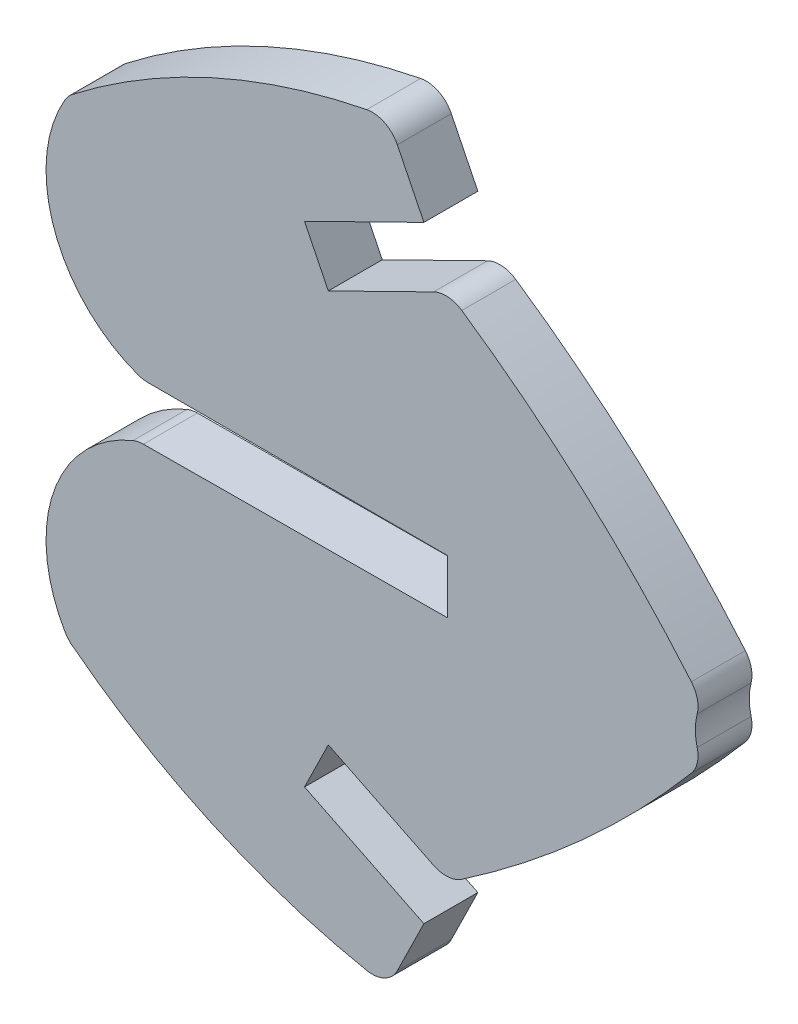
ISO-10303-21;
HEADER;
FILE_DESCRIPTION(('STEP AP214'),'2;1');
FILE_NAME('part.step','',(''),(''),'','','');
FILE_SCHEMA(('AUTOMOTIVE_DESIGN { 1 0 10303 214 1 1 1 1 }'));
ENDSEC;
DATA;
#1=APPLICATION_CONTEXT('core data for automotive mechanical design processes');
#2=APPLICATION_PROTOCOL_DEFINITION('international standard','automotive_design',2000,#1);
#3=PRODUCT_CONTEXT('',#1,'mechanical');
#4=PRODUCT('Part','Part','',(#3));
#5=PRODUCT_RELATED_PRODUCT_CATEGORY('part','',(#4));
#6=PRODUCT_DEFINITION_FORMATION('','',#4);
#7=PRODUCT_DEFINITION_CONTEXT('part definition',#1,'design');
#8=PRODUCT_DEFINITION('design','',#6,#7);
#9=PRODUCT_DEFINITION_SHAPE('','',#8);
#10=(LENGTH_UNIT() NAMED_UNIT(*) SI_UNIT(.MILLI.,.METRE.));
#11=(NAMED_UNIT(*) PLANE_ANGLE_UNIT() SI_UNIT($,.RADIAN.));
#12=(NAMED_UNIT(*) SI_UNIT($,.STERADIAN.) SOLID_ANGLE_UNIT());
#13=UNCERTAINTY_MEASURE_WITH_UNIT(LENGTH_MEASURE(1.E-05),#10,'distance_accuracy_value','');
#14=(GEOMETRIC_REPRESENTATION_CONTEXT(3) GLOBAL_UNCERTAINTY_ASSIGNED_CONTEXT((#13)) GLOBAL_UNIT_ASSIGNED_CONTEXT((#10,
#11,#12)) REPRESENTATION_CONTEXT('',''));
#15=CARTESIAN_POINT('',(0.,0.,0.));
#16=DIRECTION('',(0.,0.,1.));
#17=DIRECTION('',(1.,0.,0.));
#18=AXIS2_PLACEMENT_3D('',#15,#16,#17);
#19=CARTESIAN_POINT('',(73.3997596762323,-1.524,1.524));
#20=DIRECTION('',(0.00539437100730512,-0.999985450274871,0.));
#21=DIRECTION('',(0.999985450274871,0.00539437100730512,0.));
#22=AXIS2_PLACEMENT_3D('',#19,#20,#21);
#23=PLANE('',#22);
#24=DIRECTION('',(-0.999985450274871,-0.00539437100730512,0.));
#25=VECTOR('',#24,1.);
#26=CARTESIAN_POINT('',(73.3997596762323,-1.524,0.));
#27=LINE('',#26,#25);
#28=CARTESIAN_POINT('',(73.3997596762323,-1.524,0.));
#29=VERTEX_POINT('',#28);
#30=CARTESIAN_POINT('',(64.8048504153945,-1.57036480392224,0.));
#31=VERTEX_POINT('',#30);
#32=EDGE_CURVE('E248',#29,#31,#27,.T.);
#33=ORIENTED_EDGE('',*,*,#32,.T.);
#34=DIRECTION('',(0.,0.,-1.));
#35=VECTOR('',#34,1.);
#36=CARTESIAN_POINT('',(64.8048504153945,-1.57036480392224,1.524));
#37=LINE('',#36,#35);
#38=CARTESIAN_POINT('',(64.8048504153945,-1.57036480392224,1.524));
#39=VERTEX_POINT('',#38);
#40=EDGE_CURVE('E11',#39,#31,#37,.T.);
#41=ORIENTED_EDGE('',*,*,#40,.F.);
#42=DIRECTION('',(-0.999985450274871,-0.00539437100730512,0.));
#43=VECTOR('',#42,1.);
#44=CARTESIAN_POINT('',(73.3997596762323,-1.524,1.524));
#45=LINE('',#44,#43);
#46=CARTESIAN_POINT('',(73.3997596762323,-1.524,1.524));
#47=VERTEX_POINT('',#46);
#48=EDGE_CURVE('E302',#47,#39,#45,.T.);
#49=ORIENTED_EDGE('',*,*,#48,.F.);
#50=DIRECTION('',(0.,0.,-1.));
#51=VECTOR('',#50,1.);
#52=CARTESIAN_POINT('',(73.3997596762323,-1.524,1.524));
#53=LINE('',#52,#51);
#54=EDGE_CURVE('E244',#47,#29,#53,.T.);
#55=ORIENTED_EDGE('',*,*,#54,.T.);
#56=EDGE_LOOP('',(#33,#41,#49,#55));
#57=FACE_BOUND('',#56,.T.);
#58=ADVANCED_FACE('F32',(#57),#23,.F.);
#59=CARTESIAN_POINT('',(64.8091321973815,-2.36410325507792,1.524));
#60=DIRECTION('',(0.,0.,-1.));
#61=DIRECTION('',(-1.,0.,0.));
#62=AXIS2_PLACEMENT_3D('',#59,#60,#61);
#63=CYLINDRICAL_SURFACE('',#62,0.793750000000002);
#64=CARTESIAN_POINT('',(64.8091321973815,-2.36410325507792,0.));
#65=DIRECTION('',(0.,0.,1.));
#66=DIRECTION('',(-1.,0.,0.));
#67=AXIS2_PLACEMENT_3D('',#64,#65,#66);
#68=CIRCLE('',#67,0.793750000000002);
#69=CARTESIAN_POINT('',(64.509301597195,-1.62916062215221,0.));
#70=VERTEX_POINT('',#69);
#71=EDGE_CURVE('E251',#31,#70,#68,.T.);
#72=ORIENTED_EDGE('',*,*,#71,.T.);
#73=DIRECTION('',(0.,0.,-1.));
#74=VECTOR('',#73,1.);
#75=CARTESIAN_POINT('',(64.509301597195,-1.62916062215221,1.524));
#76=LINE('',#75,#74);
#77=CARTESIAN_POINT('',(64.509301597195,-1.62916062215221,1.524));
#78=VERTEX_POINT('',#77);
#79=EDGE_CURVE('E40',#78,#70,#76,.T.);
#80=ORIENTED_EDGE('',*,*,#79,.F.);
#81=CARTESIAN_POINT('',(64.8091321973815,-2.36410325507792,1.524));
#82=DIRECTION('',(0.,0.,1.));
#83=DIRECTION('',(-1.,0.,0.));
#84=AXIS2_PLACEMENT_3D('',#81,#82,#83);
#85=CIRCLE('',#84,0.793750000000002);
#86=EDGE_CURVE('E151',#39,#78,#85,.T.);
#87=ORIENTED_EDGE('',*,*,#86,.F.);
#88=ORIENTED_EDGE('',*,*,#40,.T.);
#89=EDGE_LOOP('',(#72,#80,#87,#88));
#90=FACE_BOUND('',#89,.T.);
#91=ADVANCED_FACE('F460',(#90),#63,.T.);
#92=CARTESIAN_POINT('',(66.0008068894311,-5.2851277776614,1.524));
#93=DIRECTION('',(0.,0.,-1.));
#94=DIRECTION('',(-1.,0.,0.));
#95=AXIS2_PLACEMENT_3D('',#92,#93,#94);
#96=CYLINDRICAL_SURFACE('',#95,3.948504005181);
#97=CARTESIAN_POINT('',(66.0008068894311,-5.2851277776614,0.));
#98=DIRECTION('',(0.,0.,1.));
#99=DIRECTION('',(-1.,0.,0.));
#100=AXIS2_PLACEMENT_3D('',#97,#98,#99);
#101=CIRCLE('',#100,3.948504005181);
#102=CARTESIAN_POINT('',(62.5889191130266,-7.27251442352373,0.));
#103=VERTEX_POINT('',#102);
#104=EDGE_CURVE('E253',#70,#103,#101,.T.);
#105=ORIENTED_EDGE('',*,*,#104,.T.);
#106=DIRECTION('',(0.,0.,-1.));
#107=VECTOR('',#106,1.);
#108=CARTESIAN_POINT('',(62.5889191130266,-7.27251442352373,1.524));
#109=LINE('',#108,#107);
#110=CARTESIAN_POINT('',(62.5889191130266,-7.27251442352373,1.524));
#111=VERTEX_POINT('',#110);
#112=EDGE_CURVE('E369',#111,#103,#109,.T.);
#113=ORIENTED_EDGE('',*,*,#112,.F.);
#114=CARTESIAN_POINT('',(66.0008068894311,-5.2851277776614,1.524));
#115=DIRECTION('',(0.,0.,1.));
#116=DIRECTION('',(-1.,0.,0.));
#117=AXIS2_PLACEMENT_3D('',#114,#115,#116);
#118=CIRCLE('',#117,3.948504005181);
#119=EDGE_CURVE('E377',#78,#111,#118,.T.);
#120=ORIENTED_EDGE('',*,*,#119,.F.);
#121=ORIENTED_EDGE('',*,*,#79,.T.);
#122=EDGE_LOOP('',(#105,#113,#120,#121));
#123=FACE_BOUND('',#122,.T.);
#124=ADVANCED_FACE('F375',(#123),#96,.T.);
#125=CARTESIAN_POINT('',(63.2747955662152,-6.87299902524562,1.524));
#126=DIRECTION('',(0.,0.,-1.));
#127=DIRECTION('',(-1.,0.,0.));
#128=AXIS2_PLACEMENT_3D('',#125,#126,#127);
#129=CYLINDRICAL_SURFACE('',#128,0.793749999999904);
#130=CARTESIAN_POINT('',(63.2747955662152,-6.87299902524562,0.));
#131=DIRECTION('',(0.,0.,1.));
#132=DIRECTION('',(1.,0.,0.));
#133=AXIS2_PLACEMENT_3D('',#130,#131,#132);
#134=CIRCLE('',#133,0.793749999999904);
#135=CARTESIAN_POINT('',(62.7882508910751,-7.5001460108819,0.));
#136=VERTEX_POINT('',#135);
#137=EDGE_CURVE('E255',#103,#136,#134,.T.);
#138=ORIENTED_EDGE('',*,*,#137,.T.);
#139=DIRECTION('',(0.,0.,-1.));
#140=VECTOR('',#139,1.);
#141=CARTESIAN_POINT('',(62.7882508910751,-7.5001460108819,1.524));
#142=LINE('',#141,#140);
#143=CARTESIAN_POINT('',(62.7882508910751,-7.5001460108819,1.524));
#144=VERTEX_POINT('',#143);
#145=EDGE_CURVE('E366',#144,#136,#142,.T.);
#146=ORIENTED_EDGE('',*,*,#145,.F.);
#147=CARTESIAN_POINT('',(63.2747955662152,-6.87299902524562,1.524));
#148=DIRECTION('',(0.,0.,1.));
#149=DIRECTION('',(1.,0.,0.));
#150=AXIS2_PLACEMENT_3D('',#147,#148,#149);
#151=CIRCLE('',#150,0.793749999999904);
#152=EDGE_CURVE('E395',#111,#144,#151,.T.);
#153=ORIENTED_EDGE('',*,*,#152,.F.);
#154=ORIENTED_EDGE('',*,*,#112,.T.);
#155=EDGE_LOOP('',(#138,#146,#153,#154));
#156=FACE_BOUND('',#155,.T.);
#157=ADVANCED_FACE('F386',(#156),#129,.T.);
#158=CARTESIAN_POINT('',(74.9681905247133,8.19956835399983,1.524));
#159=DIRECTION('',(0.,0.,-1.));
#160=DIRECTION('',(-1.,0.,0.));
#161=AXIS2_PLACEMENT_3D('',#158,#159,#160);
#162=CYLINDRICAL_SURFACE('',#161,19.8703789751968);
#163=CARTESIAN_POINT('',(74.9681905247133,8.19956835399983,0.));
#164=DIRECTION('',(0.,0.,1.));
#165=DIRECTION('',(-1.,0.,0.));
#166=AXIS2_PLACEMENT_3D('',#163,#164,#165);
#167=CIRCLE('',#166,19.8703789751968);
#168=CARTESIAN_POINT('',(71.1116370536284,-11.2929675493301,0.));
#169=VERTEX_POINT('',#168);
#170=EDGE_CURVE('E257',#136,#169,#167,.T.);
#171=ORIENTED_EDGE('',*,*,#170,.T.);
#172=DIRECTION('',(0.,0.,-1.));
#173=VECTOR('',#172,1.);
#174=CARTESIAN_POINT('',(71.1116370536284,-11.2929675493301,1.524));
#175=LINE('',#174,#173);
#176=CARTESIAN_POINT('',(71.1116370536284,-11.2929675493301,1.524));
#177=VERTEX_POINT('',#176);
#178=EDGE_CURVE('E363',#177,#169,#175,.T.);
#179=ORIENTED_EDGE('',*,*,#178,.F.);
#180=CARTESIAN_POINT('',(74.9681905247133,8.19956835399983,1.524));
#181=DIRECTION('',(0.,0.,1.));
#182=DIRECTION('',(-1.,0.,0.));
#183=AXIS2_PLACEMENT_3D('',#180,#181,#182);
#184=CIRCLE('',#183,19.8703789751968);
#185=EDGE_CURVE('E392',#144,#177,#184,.T.);
#186=ORIENTED_EDGE('',*,*,#185,.F.);
#187=ORIENTED_EDGE('',*,*,#145,.T.);
#188=EDGE_LOOP('',(#171,#179,#186,#187));
#189=FACE_BOUND('',#188,.T.);
#190=ADVANCED_FACE('F390',(#189),#162,.T.);
#191=CARTESIAN_POINT('',(71.2656924605,-10.5143110177877,1.524));
#192=DIRECTION('',(0.,0.,-1.));
#193=DIRECTION('',(-1.,0.,0.));
#194=AXIS2_PLACEMENT_3D('',#191,#192,#193);
#195=CYLINDRICAL_SURFACE('',#194,0.793750000000007);
#196=CARTESIAN_POINT('',(71.2656924605,-10.5143110177877,0.));
#197=DIRECTION('',(0.,0.,1.));
#198=DIRECTION('',(-1.,0.,0.));
#199=AXIS2_PLACEMENT_3D('',#196,#197,#198);
#200=CIRCLE('',#199,0.793750000000007);
#201=CARTESIAN_POINT('',(71.9780009134673,-10.8645334190293,0.));
#202=VERTEX_POINT('',#201);
#203=EDGE_CURVE('E259',#169,#202,#200,.T.);
#204=ORIENTED_EDGE('',*,*,#203,.T.);
#205=DIRECTION('',(0.,0.,-1.));
#206=VECTOR('',#205,1.);
#207=CARTESIAN_POINT('',(71.9780009134673,-10.8645334190293,1.524));
#208=LINE('',#207,#206);
#209=CARTESIAN_POINT('',(71.9780009134673,-10.8645334190293,1.524));
#210=VERTEX_POINT('',#209);
#211=EDGE_CURVE('E360',#210,#202,#208,.T.);
#212=ORIENTED_EDGE('',*,*,#211,.F.);
#213=CARTESIAN_POINT('',(71.2656924605,-10.5143110177877,1.524));
#214=DIRECTION('',(0.,0.,1.));
#215=DIRECTION('',(-1.,0.,0.));
#216=AXIS2_PLACEMENT_3D('',#213,#214,#215);
#217=CIRCLE('',#216,0.793750000000007);
#218=EDGE_CURVE('E394',#177,#210,#217,.T.);
#219=ORIENTED_EDGE('',*,*,#218,.F.);
#220=ORIENTED_EDGE('',*,*,#178,.T.);
#221=EDGE_LOOP('',(#204,#212,#219,#220));
#222=FACE_BOUND('',#221,.T.);
#223=ADVANCED_FACE('F473',(#222),#195,.T.);
#224=CARTESIAN_POINT('',(72.7273326656865,-9.3404865873455,1.524));
#225=DIRECTION('',(-0.897396476118458,0.441225072553876,0.));
#226=DIRECTION('',(-0.441225072553876,-0.897396476118458,0.));
#227=AXIS2_PLACEMENT_3D('',#224,#225,#226);
#228=PLANE('',#227);
#229=DIRECTION('',(0.441225072553876,0.897396476118458,0.));
#230=VECTOR('',#229,1.);
#231=CARTESIAN_POINT('',(72.7273326656865,-9.3404865873455,0.));
#232=LINE('',#231,#230);
#233=CARTESIAN_POINT('',(72.7273326656865,-9.3404865873455,0.));
#234=VERTEX_POINT('',#233);
#235=EDGE_CURVE('E261',#202,#234,#232,.T.);
#236=ORIENTED_EDGE('',*,*,#235,.T.);
#237=DIRECTION('',(0.,0.,-1.));
#238=VECTOR('',#237,1.);
#239=CARTESIAN_POINT('',(72.7273326656865,-9.3404865873455,1.524));
#240=LINE('',#239,#238);
#241=CARTESIAN_POINT('',(72.7273326656865,-9.3404865873455,1.524));
#242=VERTEX_POINT('',#241);
#243=EDGE_CURVE('E357',#242,#234,#240,.T.);
#244=ORIENTED_EDGE('',*,*,#243,.F.);
#245=DIRECTION('',(0.441225072553876,0.897396476118458,0.));
#246=VECTOR('',#245,1.);
#247=CARTESIAN_POINT('',(72.7273326656865,-9.3404865873455,1.524));
#248=LINE('',#247,#246);
#249=EDGE_CURVE('E397',#210,#242,#248,.T.);
#250=ORIENTED_EDGE('',*,*,#249,.F.);
#251=ORIENTED_EDGE('',*,*,#211,.T.);
#252=EDGE_LOOP('',(#236,#244,#250,#251));
#253=FACE_BOUND('',#252,.T.);
#254=ADVANCED_FACE('F476',(#253),#228,.F.);
#255=CARTESIAN_POINT('',(69.354858346932,-7.68233406994904,1.524));
#256=DIRECTION('',(-0.441225072553872,-0.89739647611846,0.));
#257=DIRECTION('',(0.89739647611846,-0.441225072553872,0.));
#258=AXIS2_PLACEMENT_3D('',#255,#256,#257);
#259=PLANE('',#258);
#260=DIRECTION('',(-0.89739647611846,0.441225072553872,0.));
#261=VECTOR('',#260,1.);
#262=CARTESIAN_POINT('',(69.354858346932,-7.68233406994904,0.));
#263=LINE('',#262,#261);
#264=CARTESIAN_POINT('',(69.354858346932,-7.68233406994904,0.));
#265=VERTEX_POINT('',#264);
#266=EDGE_CURVE('E263',#234,#265,#263,.T.);
#267=ORIENTED_EDGE('',*,*,#266,.T.);
#268=DIRECTION('',(0.,0.,-1.));
#269=VECTOR('',#268,1.);
#270=CARTESIAN_POINT('',(69.354858346932,-7.68233406994904,1.524));
#271=LINE('',#270,#269);
#272=CARTESIAN_POINT('',(69.354858346932,-7.68233406994904,1.524));
#273=VERTEX_POINT('',#272);
#274=EDGE_CURVE('E354',#273,#265,#271,.T.);
#275=ORIENTED_EDGE('',*,*,#274,.F.);
#276=DIRECTION('',(-0.89739647611846,0.441225072553872,0.));
#277=VECTOR('',#276,1.);
#278=CARTESIAN_POINT('',(69.354858346932,-7.68233406994904,1.524));
#279=LINE('',#278,#277);
#280=EDGE_CURVE('E403',#242,#273,#279,.T.);
#281=ORIENTED_EDGE('',*,*,#280,.F.);
#282=ORIENTED_EDGE('',*,*,#243,.T.);
#283=EDGE_LOOP('',(#267,#275,#281,#282));
#284=FACE_BOUND('',#283,.T.);
#285=ADVANCED_FACE('F480',(#284),#259,.F.);
#286=CARTESIAN_POINT('',(70.0272853575041,-6.3147018403445,1.524));
#287=DIRECTION('',(-0.89739647611846,0.441225072553873,0.));
#288=DIRECTION('',(-0.441225072553873,-0.89739647611846,0.));
#289=AXIS2_PLACEMENT_3D('',#286,#287,#288);
#290=PLANE('',#289);
#291=DIRECTION('',(0.441225072553873,0.89739647611846,0.));
#292=VECTOR('',#291,1.);
#293=CARTESIAN_POINT('',(70.0272853575041,-6.3147018403445,0.));
#294=LINE('',#293,#292);
#295=CARTESIAN_POINT('',(70.0272853575041,-6.3147018403445,0.));
#296=VERTEX_POINT('',#295);
#297=EDGE_CURVE('E265',#265,#296,#294,.T.);
#298=ORIENTED_EDGE('',*,*,#297,.T.);
#299=DIRECTION('',(0.,0.,-1.));
#300=VECTOR('',#299,1.);
#301=CARTESIAN_POINT('',(70.0272853575041,-6.3147018403445,1.524));
#302=LINE('',#301,#300);
#303=CARTESIAN_POINT('',(70.0272853575041,-6.3147018403445,1.524));
#304=VERTEX_POINT('',#303);
#305=EDGE_CURVE('E351',#304,#296,#302,.T.);
#306=ORIENTED_EDGE('',*,*,#305,.F.);
#307=DIRECTION('',(0.441225072553873,0.89739647611846,0.));
#308=VECTOR('',#307,1.);
#309=CARTESIAN_POINT('',(70.0272853575041,-6.3147018403445,1.524));
#310=LINE('',#309,#308);
#311=EDGE_CURVE('E405',#273,#304,#310,.T.);
#312=ORIENTED_EDGE('',*,*,#311,.F.);
#313=ORIENTED_EDGE('',*,*,#274,.T.);
#314=EDGE_LOOP('',(#298,#306,#312,#313));
#315=FACE_BOUND('',#314,.T.);
#316=ADVANCED_FACE('F484',(#315),#290,.F.);
#317=CARTESIAN_POINT('',(73.0006435083222,-7.77661995651303,1.524));
#318=DIRECTION('',(0.441225072553873,0.89739647611846,0.));
#319=DIRECTION('',(-0.89739647611846,0.441225072553873,0.));
#320=AXIS2_PLACEMENT_3D('',#317,#318,#319);
#321=PLANE('',#320);
#322=DIRECTION('',(0.89739647611846,-0.441225072553873,0.));
#323=VECTOR('',#322,1.);
#324=CARTESIAN_POINT('',(73.0006435083222,-7.77661995651303,0.));
#325=LINE('',#324,#323);
#326=CARTESIAN_POINT('',(73.0006435083222,-7.77661995651303,0.));
#327=VERTEX_POINT('',#326);
#328=EDGE_CURVE('E267',#296,#327,#325,.T.);
#329=ORIENTED_EDGE('',*,*,#328,.T.);
#330=DIRECTION('',(0.,0.,-1.));
#331=VECTOR('',#330,1.);
#332=CARTESIAN_POINT('',(73.0006435083222,-7.77661995651303,1.524));
#333=LINE('',#332,#331);
#334=CARTESIAN_POINT('',(73.0006435083222,-7.77661995651303,1.524));
#335=VERTEX_POINT('',#334);
#336=EDGE_CURVE('E348',#335,#327,#333,.T.);
#337=ORIENTED_EDGE('',*,*,#336,.F.);
#338=DIRECTION('',(0.89739647611846,-0.441225072553873,0.));
#339=VECTOR('',#338,1.);
#340=CARTESIAN_POINT('',(73.0006435083222,-7.77661995651303,1.524));
#341=LINE('',#340,#339);
#342=EDGE_CURVE('E407',#304,#335,#341,.T.);
#343=ORIENTED_EDGE('',*,*,#342,.F.);
#344=ORIENTED_EDGE('',*,*,#305,.T.);
#345=EDGE_LOOP('',(#329,#337,#343,#344));
#346=FACE_BOUND('',#345,.T.);
#347=ADVANCED_FACE('F488',(#346),#321,.F.);
#348=CARTESIAN_POINT('',(73.3508659096618,-7.064311503594,1.524));
#349=DIRECTION('',(0.,0.,-1.));
#350=DIRECTION('',(-1.,0.,0.));
#351=AXIS2_PLACEMENT_3D('',#348,#349,#350);
#352=CYLINDRICAL_SURFACE('',#351,0.793750000000004);
#353=CARTESIAN_POINT('',(73.3508659096618,-7.064311503594,0.));
#354=DIRECTION('',(0.,0.,1.));
#355=DIRECTION('',(1.,0.,0.));
#356=AXIS2_PLACEMENT_3D('',#353,#354,#355);
#357=CIRCLE('',#356,0.793750000000004);
#358=CARTESIAN_POINT('',(73.7975396419504,-7.72045298177011,0.));
#359=VERTEX_POINT('',#358);
#360=EDGE_CURVE('E269',#327,#359,#357,.T.);
#361=ORIENTED_EDGE('',*,*,#360,.T.);
#362=DIRECTION('',(0.,0.,-1.));
#363=VECTOR('',#362,1.);
#364=CARTESIAN_POINT('',(73.7975396419504,-7.72045298177011,1.524));
#365=LINE('',#364,#363);
#366=CARTESIAN_POINT('',(73.7975396419504,-7.72045298177011,1.524));
#367=VERTEX_POINT('',#366);
#368=EDGE_CURVE('E345',#367,#359,#365,.T.);
#369=ORIENTED_EDGE('',*,*,#368,.F.);
#370=CARTESIAN_POINT('',(73.3508659096618,-7.064311503594,1.524));
#371=DIRECTION('',(0.,0.,1.));
#372=DIRECTION('',(1.,0.,0.));
#373=AXIS2_PLACEMENT_3D('',#370,#371,#372);
#374=CIRCLE('',#373,0.793750000000004);
#375=EDGE_CURVE('E409',#335,#367,#374,.T.);
#376=ORIENTED_EDGE('',*,*,#375,.F.);
#377=ORIENTED_EDGE('',*,*,#336,.T.);
#378=EDGE_LOOP('',(#361,#369,#376,#377));
#379=FACE_BOUND('',#378,.T.);
#380=ADVANCED_FACE('F492',(#379),#352,.T.);
#381=CARTESIAN_POINT('',(55.6042447035405,19.0045916556672,1.524));
#382=DIRECTION('',(0.,0.,-1.));
#383=DIRECTION('',(-1.,0.,0.));
#384=AXIS2_PLACEMENT_3D('',#381,#382,#383);
#385=CYLINDRICAL_SURFACE('',#384,32.329924088822);
#386=CARTESIAN_POINT('',(55.6042447035405,19.0045916556672,0.));
#387=DIRECTION('',(0.,0.,1.));
#388=DIRECTION('',(1.,0.,0.));
#389=AXIS2_PLACEMENT_3D('',#386,#387,#388);
#390=CIRCLE('',#389,32.329924088822);
#391=CARTESIAN_POINT('',(80.2835558518824,-1.87974680242873,0.));
#392=VERTEX_POINT('',#391);
#393=EDGE_CURVE('E271',#359,#392,#390,.T.);
#394=ORIENTED_EDGE('',*,*,#393,.T.);
#395=DIRECTION('',(0.,0.,-1.));
#396=VECTOR('',#395,1.);
#397=CARTESIAN_POINT('',(80.2835558518824,-1.87974680242873,1.524));
#398=LINE('',#397,#396);
#399=CARTESIAN_POINT('',(80.2835558518824,-1.87974680242873,1.524));
#400=VERTEX_POINT('',#399);
#401=EDGE_CURVE('E342',#400,#392,#398,.T.);
#402=ORIENTED_EDGE('',*,*,#401,.F.);
#403=CARTESIAN_POINT('',(55.6042447035405,19.0045916556672,1.524));
#404=DIRECTION('',(0.,0.,1.));
#405=DIRECTION('',(1.,0.,0.));
#406=AXIS2_PLACEMENT_3D('',#403,#404,#405);
#407=CIRCLE('',#406,32.329924088822);
#408=EDGE_CURVE('E411',#367,#400,#407,.T.);
#409=ORIENTED_EDGE('',*,*,#408,.F.);
#410=ORIENTED_EDGE('',*,*,#368,.T.);
#411=EDGE_LOOP('',(#394,#402,#409,#410));
#412=FACE_BOUND('',#411,.T.);
#413=ADVANCED_FACE('F496',(#412),#385,.T.);
#414=CARTESIAN_POINT('',(79.6776403177111,-1.36700375961889,1.524));
#415=DIRECTION('',(0.,0.,-1.));
#416=DIRECTION('',(-1.,0.,0.));
#417=AXIS2_PLACEMENT_3D('',#414,#415,#416);
#418=CYLINDRICAL_SURFACE('',#417,0.793750000000005);
#419=CARTESIAN_POINT('',(79.6776403177111,-1.36700375961889,0.));
#420=DIRECTION('',(0.,0.,1.));
#421=DIRECTION('',(1.,0.,0.));
#422=AXIS2_PLACEMENT_3D('',#419,#420,#421);
#423=CIRCLE('',#422,0.793750000000005);
#424=CARTESIAN_POINT('',(80.4470170188281,-1.17181525002305,0.));
#425=VERTEX_POINT('',#424);
#426=EDGE_CURVE('E273',#392,#425,#423,.T.);
#427=ORIENTED_EDGE('',*,*,#426,.T.);
#428=DIRECTION('',(0.,0.,-1.));
#429=VECTOR('',#428,1.);
#430=CARTESIAN_POINT('',(80.4470170188281,-1.17181525002305,1.524));
#431=LINE('',#430,#429);
#432=CARTESIAN_POINT('',(80.4470170188281,-1.17181525002305,1.524));
#433=VERTEX_POINT('',#432);
#434=EDGE_CURVE('E339',#433,#425,#431,.T.);
#435=ORIENTED_EDGE('',*,*,#434,.F.);
#436=CARTESIAN_POINT('',(79.6776403177111,-1.36700375961889,1.524));
#437=DIRECTION('',(0.,0.,1.));
#438=DIRECTION('',(1.,0.,0.));
#439=AXIS2_PLACEMENT_3D('',#436,#437,#438);
#440=CIRCLE('',#439,0.793750000000005);
#441=EDGE_CURVE('E413',#400,#433,#440,.T.);
#442=ORIENTED_EDGE('',*,*,#441,.F.);
#443=ORIENTED_EDGE('',*,*,#401,.T.);
#444=EDGE_LOOP('',(#427,#435,#442,#443));
#445=FACE_BOUND('',#444,.T.);
#446=ADVANCED_FACE('F500',(#445),#418,.T.);
#447=CARTESIAN_POINT('',(82.0623903099253,-0.762,1.524));
#448=DIRECTION('',(0.,0.,-1.));
#449=DIRECTION('',(-1.,0.,0.));
#450=AXIS2_PLACEMENT_3D('',#447,#448,#449);
#451=CYLINDRICAL_SURFACE('',#450,1.66654715167071);
#452=CARTESIAN_POINT('',(82.0623903099253,-0.762,0.));
#453=DIRECTION('',(0.,0.,-1.));
#454=DIRECTION('',(-1.,0.,0.));
#455=AXIS2_PLACEMENT_3D('',#452,#453,#454);
#456=CIRCLE('',#455,1.66654715167071);
#457=CARTESIAN_POINT('',(80.4470170188281,-0.352184749976949,0.));
#458=VERTEX_POINT('',#457);
#459=EDGE_CURVE('E275',#425,#458,#456,.T.);
#460=ORIENTED_EDGE('',*,*,#459,.T.);
#461=DIRECTION('',(0.,0.,-1.));
#462=VECTOR('',#461,1.);
#463=CARTESIAN_POINT('',(80.4470170188281,-0.352184749976949,1.524));
#464=LINE('',#463,#462);
#465=CARTESIAN_POINT('',(80.4470170188281,-0.352184749976949,1.524));
#466=VERTEX_POINT('',#465);
#467=EDGE_CURVE('E336',#466,#458,#464,.T.);
#468=ORIENTED_EDGE('',*,*,#467,.F.);
#469=CARTESIAN_POINT('',(82.0623903099253,-0.762,1.524));
#470=DIRECTION('',(0.,0.,-1.));
#471=DIRECTION('',(-1.,0.,0.));
#472=AXIS2_PLACEMENT_3D('',#469,#470,#471);
#473=CIRCLE('',#472,1.66654715167071);
#474=EDGE_CURVE('E415',#433,#466,#473,.T.);
#475=ORIENTED_EDGE('',*,*,#474,.F.);
#476=ORIENTED_EDGE('',*,*,#434,.T.);
#477=EDGE_LOOP('',(#460,#468,#475,#476));
#478=FACE_BOUND('',#477,.T.);
#479=ADVANCED_FACE('F504',(#478),#451,.F.);
#480=CARTESIAN_POINT('',(79.6776403177111,-0.156996240381111,1.524));
#481=DIRECTION('',(0.,0.,-1.));
#482=DIRECTION('',(-1.,0.,0.));
#483=AXIS2_PLACEMENT_3D('',#480,#481,#482);
#484=CYLINDRICAL_SURFACE('',#483,0.793750000000005);
#485=CARTESIAN_POINT('',(79.6776403177111,-0.156996240381111,0.));
#486=DIRECTION('',(0.,0.,1.));
#487=DIRECTION('',(-1.,0.,0.));
#488=AXIS2_PLACEMENT_3D('',#485,#486,#487);
#489=CIRCLE('',#488,0.793750000000005);
#490=CARTESIAN_POINT('',(80.2835558518825,0.355746802428843,0.));
#491=VERTEX_POINT('',#490);
#492=EDGE_CURVE('E277',#458,#491,#489,.T.);
#493=ORIENTED_EDGE('',*,*,#492,.T.);
#494=DIRECTION('',(0.,0.,-1.));
#495=VECTOR('',#494,1.);
#496=CARTESIAN_POINT('',(80.2835558518825,0.355746802428843,1.524));
#497=LINE('',#496,#495);
#498=CARTESIAN_POINT('',(80.2835558518825,0.355746802428843,1.524));
#499=VERTEX_POINT('',#498);
#500=EDGE_CURVE('E333',#499,#491,#497,.T.);
#501=ORIENTED_EDGE('',*,*,#500,.F.);
#502=CARTESIAN_POINT('',(79.6776403177111,-0.156996240381111,1.524));
#503=DIRECTION('',(0.,0.,1.));
#504=DIRECTION('',(-1.,0.,0.));
#505=AXIS2_PLACEMENT_3D('',#502,#503,#504);
#506=CIRCLE('',#505,0.793750000000005);
#507=EDGE_CURVE('E417',#466,#499,#506,.T.);
#508=ORIENTED_EDGE('',*,*,#507,.F.);
#509=ORIENTED_EDGE('',*,*,#467,.T.);
#510=EDGE_LOOP('',(#493,#501,#508,#509));
#511=FACE_BOUND('',#510,.T.);
#512=ADVANCED_FACE('F508',(#511),#484,.T.);
#513=CARTESIAN_POINT('',(55.6042447035405,-20.5285916556672,1.524));
#514=DIRECTION('',(0.,0.,-1.));
#515=DIRECTION('',(-1.,0.,0.));
#516=AXIS2_PLACEMENT_3D('',#513,#514,#515);
#517=CYLINDRICAL_SURFACE('',#516,32.3299240888219);
#518=CARTESIAN_POINT('',(55.6042447035405,-20.5285916556672,0.));
#519=DIRECTION('',(0.,0.,1.));
#520=DIRECTION('',(-1.,0.,0.));
#521=AXIS2_PLACEMENT_3D('',#518,#519,#520);
#522=CIRCLE('',#521,32.3299240888219);
#523=CARTESIAN_POINT('',(73.7975396419505,6.19645298177026,0.));
#524=VERTEX_POINT('',#523);
#525=EDGE_CURVE('E279',#491,#524,#522,.T.);
#526=ORIENTED_EDGE('',*,*,#525,.T.);
#527=DIRECTION('',(0.,0.,-1.));
#528=VECTOR('',#527,1.);
#529=CARTESIAN_POINT('',(73.7975396419505,6.19645298177026,1.524));
#530=LINE('',#529,#528);
#531=CARTESIAN_POINT('',(73.7975396419505,6.19645298177026,1.524));
#532=VERTEX_POINT('',#531);
#533=EDGE_CURVE('E330',#532,#524,#530,.T.);
#534=ORIENTED_EDGE('',*,*,#533,.F.);
#535=CARTESIAN_POINT('',(55.6042447035405,-20.5285916556672,1.524));
#536=DIRECTION('',(0.,0.,1.));
#537=DIRECTION('',(-1.,0.,0.));
#538=AXIS2_PLACEMENT_3D('',#535,#536,#537);
#539=CIRCLE('',#538,32.3299240888219);
#540=EDGE_CURVE('E419',#499,#532,#539,.T.);
#541=ORIENTED_EDGE('',*,*,#540,.F.);
#542=ORIENTED_EDGE('',*,*,#500,.T.);
#543=EDGE_LOOP('',(#526,#534,#541,#542));
#544=FACE_BOUND('',#543,.T.);
#545=ADVANCED_FACE('F512',(#544),#517,.T.);
#546=CARTESIAN_POINT('',(73.3508659096618,5.540311503594,1.524));
#547=DIRECTION('',(0.,0.,-1.));
#548=DIRECTION('',(-1.,0.,0.));
#549=AXIS2_PLACEMENT_3D('',#546,#547,#548);
#550=CYLINDRICAL_SURFACE('',#549,0.793750000000004);
#551=CARTESIAN_POINT('',(73.3508659096618,5.540311503594,0.));
#552=DIRECTION('',(0.,0.,1.));
#553=DIRECTION('',(-1.,0.,0.));
#554=AXIS2_PLACEMENT_3D('',#551,#552,#553);
#555=CIRCLE('',#554,0.793750000000004);
#556=CARTESIAN_POINT('',(73.0006435083222,6.25261995651303,0.));
#557=VERTEX_POINT('',#556);
#558=EDGE_CURVE('E281',#524,#557,#555,.T.);
#559=ORIENTED_EDGE('',*,*,#558,.T.);
#560=DIRECTION('',(0.,0.,-1.));
#561=VECTOR('',#560,1.);
#562=CARTESIAN_POINT('',(73.0006435083222,6.25261995651303,1.524));
#563=LINE('',#562,#561);
#564=CARTESIAN_POINT('',(73.0006435083222,6.25261995651303,1.524));
#565=VERTEX_POINT('',#564);
#566=EDGE_CURVE('E327',#565,#557,#563,.T.);
#567=ORIENTED_EDGE('',*,*,#566,.F.);
#568=CARTESIAN_POINT('',(73.3508659096618,5.540311503594,1.524));
#569=DIRECTION('',(0.,0.,1.));
#570=DIRECTION('',(-1.,0.,0.));
#571=AXIS2_PLACEMENT_3D('',#568,#569,#570);
#572=CIRCLE('',#571,0.793750000000004);
#573=EDGE_CURVE('E421',#532,#565,#572,.T.);
#574=ORIENTED_EDGE('',*,*,#573,.F.);
#575=ORIENTED_EDGE('',*,*,#533,.T.);
#576=EDGE_LOOP('',(#559,#567,#574,#575));
#577=FACE_BOUND('',#576,.T.);
#578=ADVANCED_FACE('F516',(#577),#550,.T.);
#579=CARTESIAN_POINT('',(73.0006435083222,6.25261995651303,1.524));
#580=DIRECTION('',(0.441225072553873,-0.89739647611846,0.));
#581=DIRECTION('',(0.89739647611846,0.441225072553873,0.));
#582=AXIS2_PLACEMENT_3D('',#579,#580,#581);
#583=PLANE('',#582);
#584=DIRECTION('',(-0.89739647611846,-0.441225072553873,0.));
#585=VECTOR('',#584,1.);
#586=CARTESIAN_POINT('',(73.0006435083222,6.25261995651303,0.));
#587=LINE('',#586,#585);
#588=CARTESIAN_POINT('',(70.0272853575041,4.7907018403445,0.));
#589=VERTEX_POINT('',#588);
#590=EDGE_CURVE('E283',#557,#589,#587,.T.);
#591=ORIENTED_EDGE('',*,*,#590,.T.);
#592=DIRECTION('',(0.,0.,-1.));
#593=VECTOR('',#592,1.);
#594=CARTESIAN_POINT('',(70.0272853575041,4.7907018403445,1.524));
#595=LINE('',#594,#593);
#596=CARTESIAN_POINT('',(70.0272853575041,4.7907018403445,1.524));
#597=VERTEX_POINT('',#596);
#598=EDGE_CURVE('E324',#597,#589,#595,.T.);
#599=ORIENTED_EDGE('',*,*,#598,.F.);
#600=DIRECTION('',(-0.89739647611846,-0.441225072553873,0.));
#601=VECTOR('',#600,1.);
#602=CARTESIAN_POINT('',(73.0006435083222,6.25261995651303,1.524));
#603=LINE('',#602,#601);
#604=EDGE_CURVE('E423',#565,#597,#603,.T.);
#605=ORIENTED_EDGE('',*,*,#604,.F.);
#606=ORIENTED_EDGE('',*,*,#566,.T.);
#607=EDGE_LOOP('',(#591,#599,#605,#606));
#608=FACE_BOUND('',#607,.T.);
#609=ADVANCED_FACE('F520',(#608),#583,.F.);
#610=CARTESIAN_POINT('',(70.0272853575041,4.7907018403445,1.524));
#611=DIRECTION('',(-0.89739647611846,-0.441225072553873,0.));
#612=DIRECTION('',(0.441225072553873,-0.89739647611846,0.));
#613=AXIS2_PLACEMENT_3D('',#610,#611,#612);
#614=PLANE('',#613);
#615=DIRECTION('',(-0.441225072553873,0.89739647611846,0.));
#616=VECTOR('',#615,1.);
#617=CARTESIAN_POINT('',(70.0272853575041,4.7907018403445,0.));
#618=LINE('',#617,#616);
#619=CARTESIAN_POINT('',(69.354858346932,6.15833406994903,0.));
#620=VERTEX_POINT('',#619);
#621=EDGE_CURVE('E285',#589,#620,#618,.T.);
#622=ORIENTED_EDGE('',*,*,#621,.T.);
#623=DIRECTION('',(0.,0.,-1.));
#624=VECTOR('',#623,1.);
#625=CARTESIAN_POINT('',(69.354858346932,6.15833406994903,1.524));
#626=LINE('',#625,#624);
#627=CARTESIAN_POINT('',(69.354858346932,6.15833406994903,1.524));
#628=VERTEX_POINT('',#627);
#629=EDGE_CURVE('E321',#628,#620,#626,.T.);
#630=ORIENTED_EDGE('',*,*,#629,.F.);
#631=DIRECTION('',(-0.441225072553873,0.89739647611846,0.));
#632=VECTOR('',#631,1.);
#633=CARTESIAN_POINT('',(70.0272853575041,4.7907018403445,1.524));
#634=LINE('',#633,#632);
#635=EDGE_CURVE('E425',#597,#628,#634,.T.);
#636=ORIENTED_EDGE('',*,*,#635,.F.);
#637=ORIENTED_EDGE('',*,*,#598,.T.);
#638=EDGE_LOOP('',(#622,#630,#636,#637));
#639=FACE_BOUND('',#638,.T.);
#640=ADVANCED_FACE('F524',(#639),#614,.F.);
#641=CARTESIAN_POINT('',(69.354858346932,6.15833406994903,1.524));
#642=DIRECTION('',(-0.441225072553873,0.89739647611846,0.));
#643=DIRECTION('',(-0.89739647611846,-0.441225072553873,0.));
#644=AXIS2_PLACEMENT_3D('',#641,#642,#643);
#645=PLANE('',#644);
#646=DIRECTION('',(0.89739647611846,0.441225072553873,0.));
#647=VECTOR('',#646,1.);
#648=CARTESIAN_POINT('',(69.354858346932,6.15833406994903,0.));
#649=LINE('',#648,#647);
#650=CARTESIAN_POINT('',(72.7273326656603,7.81648658733262,0.));
#651=VERTEX_POINT('',#650);
#652=EDGE_CURVE('E287',#620,#651,#649,.T.);
#653=ORIENTED_EDGE('',*,*,#652,.T.);
#654=DIRECTION('',(0.,0.,-1.));
#655=VECTOR('',#654,1.);
#656=CARTESIAN_POINT('',(72.7273326656603,7.81648658733262,1.524));
#657=LINE('',#656,#655);
#658=CARTESIAN_POINT('',(72.7273326656603,7.81648658733262,1.524));
#659=VERTEX_POINT('',#658);
#660=EDGE_CURVE('E318',#659,#651,#657,.T.);
#661=ORIENTED_EDGE('',*,*,#660,.F.);
#662=DIRECTION('',(0.89739647611846,0.441225072553873,0.));
#663=VECTOR('',#662,1.);
#664=CARTESIAN_POINT('',(69.354858346932,6.15833406994903,1.524));
#665=LINE('',#664,#663);
#666=EDGE_CURVE('E427',#628,#659,#665,.T.);
#667=ORIENTED_EDGE('',*,*,#666,.F.);
#668=ORIENTED_EDGE('',*,*,#629,.T.);
#669=EDGE_LOOP('',(#653,#661,#667,#668));
#670=FACE_BOUND('',#669,.T.);
#671=ADVANCED_FACE('F528',(#670),#645,.F.);
#672=CARTESIAN_POINT('',(72.7273326656603,7.81648658733262,1.524));
#673=DIRECTION('',(-0.89739647611846,-0.441225072553873,0.));
#674=DIRECTION('',(0.441225072553873,-0.89739647611846,0.));
#675=AXIS2_PLACEMENT_3D('',#672,#673,#674);
#676=PLANE('',#675);
#677=DIRECTION('',(-0.441225072553873,0.89739647611846,0.));
#678=VECTOR('',#677,1.);
#679=CARTESIAN_POINT('',(72.7273326656603,7.81648658733262,0.));
#680=LINE('',#679,#678);
#681=CARTESIAN_POINT('',(71.9780009134411,9.34053341901651,0.));
#682=VERTEX_POINT('',#681);
#683=EDGE_CURVE('E289',#651,#682,#680,.T.);
#684=ORIENTED_EDGE('',*,*,#683,.T.);
#685=DIRECTION('',(0.,0.,-1.));
#686=VECTOR('',#685,1.);
#687=CARTESIAN_POINT('',(71.9780009134411,9.34053341901651,1.524));
#688=LINE('',#687,#686);
#689=CARTESIAN_POINT('',(71.9780009134411,9.34053341901651,1.524));
#690=VERTEX_POINT('',#689);
#691=EDGE_CURVE('E315',#690,#682,#688,.T.);
#692=ORIENTED_EDGE('',*,*,#691,.F.);
#693=DIRECTION('',(-0.441225072553873,0.89739647611846,0.));
#694=VECTOR('',#693,1.);
#695=CARTESIAN_POINT('',(72.7273326656603,7.81648658733262,1.524));
#696=LINE('',#695,#694);
#697=EDGE_CURVE('E429',#659,#690,#696,.T.);
#698=ORIENTED_EDGE('',*,*,#697,.F.);
#699=ORIENTED_EDGE('',*,*,#660,.T.);
#700=EDGE_LOOP('',(#684,#692,#698,#699));
#701=FACE_BOUND('',#700,.T.);
#702=ADVANCED_FACE('F532',(#701),#676,.F.);
#703=CARTESIAN_POINT('',(71.265692460522,8.99031101767688,1.524));
#704=DIRECTION('',(0.,0.,-1.));
#705=DIRECTION('',(-1.,0.,0.));
#706=AXIS2_PLACEMENT_3D('',#703,#704,#705);
#707=CYLINDRICAL_SURFACE('',#706,0.793750000000002);
#708=CARTESIAN_POINT('',(71.265692460522,8.99031101767688,0.));
#709=DIRECTION('',(0.,0.,1.));
#710=DIRECTION('',(1.,0.,0.));
#711=AXIS2_PLACEMENT_3D('',#708,#709,#710);
#712=CIRCLE('',#711,0.793750000000002);
#713=CARTESIAN_POINT('',(71.1116370536504,9.76896754921925,0.));
#714=VERTEX_POINT('',#713);
#715=EDGE_CURVE('E291',#682,#714,#712,.T.);
#716=ORIENTED_EDGE('',*,*,#715,.T.);
#717=DIRECTION('',(0.,0.,-1.));
#718=VECTOR('',#717,1.);
#719=CARTESIAN_POINT('',(71.1116370536504,9.76896754921925,1.524));
#720=LINE('',#719,#718);
#721=CARTESIAN_POINT('',(71.1116370536504,9.76896754921925,1.524));
#722=VERTEX_POINT('',#721);
#723=EDGE_CURVE('E312',#722,#714,#720,.T.);
#724=ORIENTED_EDGE('',*,*,#723,.F.);
#725=CARTESIAN_POINT('',(71.265692460522,8.99031101767688,1.524));
#726=DIRECTION('',(0.,0.,1.));
#727=DIRECTION('',(1.,0.,0.));
#728=AXIS2_PLACEMENT_3D('',#725,#726,#727);
#729=CIRCLE('',#728,0.793750000000002);
#730=EDGE_CURVE('E431',#690,#722,#729,.T.);
#731=ORIENTED_EDGE('',*,*,#730,.F.);
#732=ORIENTED_EDGE('',*,*,#691,.T.);
#733=EDGE_LOOP('',(#716,#724,#731,#732));
#734=FACE_BOUND('',#733,.T.);
#735=ADVANCED_FACE('F536',(#734),#707,.T.);
#736=CARTESIAN_POINT('',(74.9681905247901,-9.7235683540977,1.524));
#737=DIRECTION('',(0.,0.,-1.));
#738=DIRECTION('',(-1.,0.,0.));
#739=AXIS2_PLACEMENT_3D('',#736,#737,#738);
#740=CYLINDRICAL_SURFACE('',#739,19.8703789751947);
#741=CARTESIAN_POINT('',(74.9681905247901,-9.7235683540977,0.));
#742=DIRECTION('',(0.,0.,1.));
#743=DIRECTION('',(1.,0.,0.));
#744=AXIS2_PLACEMENT_3D('',#741,#742,#743);
#745=CIRCLE('',#744,19.8703789751947);
#746=CARTESIAN_POINT('',(62.7882508911527,5.97614601078198,0.));
#747=VERTEX_POINT('',#746);
#748=EDGE_CURVE('E293',#714,#747,#745,.T.);
#749=ORIENTED_EDGE('',*,*,#748,.T.);
#750=DIRECTION('',(0.,0.,-1.));
#751=VECTOR('',#750,1.);
#752=CARTESIAN_POINT('',(62.7882508911527,5.97614601078198,1.524));
#753=LINE('',#752,#751);
#754=CARTESIAN_POINT('',(62.7882508911527,5.97614601078198,1.524));
#755=VERTEX_POINT('',#754);
#756=EDGE_CURVE('E309',#755,#747,#753,.T.);
#757=ORIENTED_EDGE('',*,*,#756,.F.);
#758=CARTESIAN_POINT('',(74.9681905247901,-9.7235683540977,1.524));
#759=DIRECTION('',(0.,0.,1.));
#760=DIRECTION('',(1.,0.,0.));
#761=AXIS2_PLACEMENT_3D('',#758,#759,#760);
#762=CIRCLE('',#761,19.8703789751947);
#763=EDGE_CURVE('E433',#722,#755,#762,.T.);
#764=ORIENTED_EDGE('',*,*,#763,.F.);
#765=ORIENTED_EDGE('',*,*,#723,.T.);
#766=EDGE_LOOP('',(#749,#757,#764,#765));
#767=FACE_BOUND('',#766,.T.);
#768=ADVANCED_FACE('F540',(#767),#740,.T.);
#769=CARTESIAN_POINT('',(63.2747955663332,5.34899902517692,1.524));
#770=DIRECTION('',(0.,0.,-1.));
#771=DIRECTION('',(-1.,0.,0.));
#772=AXIS2_PLACEMENT_3D('',#769,#770,#771);
#773=CYLINDRICAL_SURFACE('',#772,0.793750000000009);
#774=CARTESIAN_POINT('',(63.2747955663332,5.34899902517692,0.));
#775=DIRECTION('',(0.,0.,1.));
#776=DIRECTION('',(-1.,0.,0.));
#777=AXIS2_PLACEMENT_3D('',#774,#775,#776);
#778=CIRCLE('',#777,0.793750000000009);
#779=CARTESIAN_POINT('',(62.5889191131446,5.74851442345514,0.));
#780=VERTEX_POINT('',#779);
#781=EDGE_CURVE('E295',#747,#780,#778,.T.);
#782=ORIENTED_EDGE('',*,*,#781,.T.);
#783=DIRECTION('',(0.,0.,-1.));
#784=VECTOR('',#783,1.);
#785=CARTESIAN_POINT('',(62.5889191131446,5.74851442345514,1.524));
#786=LINE('',#785,#784);
#787=CARTESIAN_POINT('',(62.5889191131446,5.74851442345514,1.524));
#788=VERTEX_POINT('',#787);
#789=EDGE_CURVE('E306',#788,#780,#786,.T.);
#790=ORIENTED_EDGE('',*,*,#789,.F.);
#791=CARTESIAN_POINT('',(63.2747955663332,5.34899902517692,1.524));
#792=DIRECTION('',(0.,0.,1.));
#793=DIRECTION('',(-1.,0.,0.));
#794=AXIS2_PLACEMENT_3D('',#791,#792,#793);
#795=CIRCLE('',#794,0.793750000000009);
#796=EDGE_CURVE('E435',#755,#788,#795,.T.);
#797=ORIENTED_EDGE('',*,*,#796,.F.);
#798=ORIENTED_EDGE('',*,*,#756,.T.);
#799=EDGE_LOOP('',(#782,#790,#797,#798));
#800=FACE_BOUND('',#799,.T.);
#801=ADVANCED_FACE('F441',(#800),#773,.T.);
#802=CARTESIAN_POINT('',(66.0008068893889,3.76112777755153,1.524));
#803=DIRECTION('',(0.,0.,-1.));
#804=DIRECTION('',(-1.,0.,0.));
#805=AXIS2_PLACEMENT_3D('',#802,#803,#804);
#806=CYLINDRICAL_SURFACE('',#805,3.94850400506329);
#807=CARTESIAN_POINT('',(66.0008068893889,3.76112777755153,0.));
#808=DIRECTION('',(0.,0.,1.));
#809=DIRECTION('',(1.,0.,0.));
#810=AXIS2_PLACEMENT_3D('',#807,#808,#809);
#811=CIRCLE('',#810,3.94850400506329);
#812=CARTESIAN_POINT('',(64.6602795832036,0.0471446839749654,0.));
#813=VERTEX_POINT('',#812);
#814=EDGE_CURVE('E297',#780,#813,#811,.T.);
#815=ORIENTED_EDGE('',*,*,#814,.T.);
#816=DIRECTION('',(0.,0.,-1.));
#817=VECTOR('',#816,1.);
#818=CARTESIAN_POINT('',(64.6602795832036,0.0471446839749654,1.524));
#819=LINE('',#818,#817);
#820=CARTESIAN_POINT('',(64.6602795832036,0.0471446839749654,1.524));
#821=VERTEX_POINT('',#820);
#822=EDGE_CURVE('E239',#821,#813,#819,.T.);
#823=ORIENTED_EDGE('',*,*,#822,.F.);
#824=CARTESIAN_POINT('',(66.0008068893889,3.76112777755153,1.524));
#825=DIRECTION('',(0.,0.,1.));
#826=DIRECTION('',(1.,0.,0.));
#827=AXIS2_PLACEMENT_3D('',#824,#825,#826);
#828=CIRCLE('',#827,3.94850400506329);
#829=EDGE_CURVE('E230',#788,#821,#828,.T.);
#830=ORIENTED_EDGE('',*,*,#829,.F.);
#831=ORIENTED_EDGE('',*,*,#789,.T.);
#832=EDGE_LOOP('',(#815,#823,#830,#831));
#833=FACE_BOUND('',#832,.T.);
#834=ADVANCED_FACE('F445',(#833),#806,.T.);
#835=CARTESIAN_POINT('',(64.9297597579533,0.793750000000002,1.524));
#836=DIRECTION('',(0.,0.,-1.));
#837=DIRECTION('',(-1.,0.,0.));
#838=AXIS2_PLACEMENT_3D('',#835,#836,#837);
#839=CYLINDRICAL_SURFACE('',#838,0.793749999999999);
#840=CARTESIAN_POINT('',(64.9297597579533,0.793750000000002,0.));
#841=DIRECTION('',(0.,0.,1.));
#842=DIRECTION('',(1.,0.,0.));
#843=AXIS2_PLACEMENT_3D('',#840,#841,#842);
#844=CIRCLE('',#843,0.793749999999999);
#845=CARTESIAN_POINT('',(64.9297597579533,0.,0.));
#846=VERTEX_POINT('',#845);
#847=EDGE_CURVE('E238',#813,#846,#844,.T.);
#848=ORIENTED_EDGE('',*,*,#847,.T.);
#849=DIRECTION('',(0.,0.,-1.));
#850=VECTOR('',#849,1.);
#851=CARTESIAN_POINT('',(64.9297597579533,0.,1.524));
#852=LINE('',#851,#850);
#853=CARTESIAN_POINT('',(64.9297597579533,0.,1.524));
#854=VERTEX_POINT('',#853);
#855=EDGE_CURVE('E235',#854,#846,#852,.T.);
#856=ORIENTED_EDGE('',*,*,#855,.F.);
#857=CARTESIAN_POINT('',(64.9297597579533,0.793750000000002,1.524));
#858=DIRECTION('',(0.,0.,1.));
#859=DIRECTION('',(1.,0.,0.));
#860=AXIS2_PLACEMENT_3D('',#857,#858,#859);
#861=CIRCLE('',#860,0.793749999999999);
#862=EDGE_CURVE('E224',#821,#854,#861,.T.);
#863=ORIENTED_EDGE('',*,*,#862,.F.);
#864=ORIENTED_EDGE('',*,*,#822,.T.);
#865=EDGE_LOOP('',(#848,#856,#863,#864));
#866=FACE_BOUND('',#865,.T.);
#867=ADVANCED_FACE('F236',(#866),#839,.T.);
#868=CARTESIAN_POINT('',(73.3997596762323,0.,1.524));
#869=DIRECTION('',(0.,1.,0.));
#870=DIRECTION('',(-1.,0.,0.));
#871=AXIS2_PLACEMENT_3D('',#868,#869,#870);
#872=PLANE('',#871);
#873=DIRECTION('',(1.,0.,0.));
#874=VECTOR('',#873,1.);
#875=CARTESIAN_POINT('',(73.3997596762323,0.,0.));
#876=LINE('',#875,#874);
#877=CARTESIAN_POINT('',(73.3997596762323,0.,0.));
#878=VERTEX_POINT('',#877);
#879=EDGE_CURVE('E137',#846,#878,#876,.T.);
#880=ORIENTED_EDGE('',*,*,#879,.T.);
#881=DIRECTION('',(0.,0.,-1.));
#882=VECTOR('',#881,1.);
#883=CARTESIAN_POINT('',(73.3997596762323,0.,1.524));
#884=LINE('',#883,#882);
#885=CARTESIAN_POINT('',(73.3997596762323,0.,1.524));
#886=VERTEX_POINT('',#885);
#887=EDGE_CURVE('E240',#886,#878,#884,.T.);
#888=ORIENTED_EDGE('',*,*,#887,.F.);
#889=DIRECTION('',(1.,0.,0.));
#890=VECTOR('',#889,1.);
#891=CARTESIAN_POINT('',(73.3997596762323,0.,1.524));
#892=LINE('',#891,#890);
#893=EDGE_CURVE('E228',#854,#886,#892,.T.);
#894=ORIENTED_EDGE('',*,*,#893,.F.);
#895=ORIENTED_EDGE('',*,*,#855,.T.);
#896=EDGE_LOOP('',(#880,#888,#894,#895));
#897=FACE_BOUND('',#896,.T.);
#898=ADVANCED_FACE('F242',(#897),#872,.F.);
#899=CARTESIAN_POINT('',(73.3997596762323,-1.524,1.524));
#900=DIRECTION('',(1.,0.,0.));
#901=DIRECTION('',(0.,0.,-1.));
#902=AXIS2_PLACEMENT_3D('',#899,#900,#901);
#903=PLANE('',#902);
#904=DIRECTION('',(0.,-1.,0.));
#905=VECTOR('',#904,1.);
#906=CARTESIAN_POINT('',(73.3997596762323,-1.524,0.));
#907=LINE('',#906,#905);
#908=EDGE_CURVE('E143',#878,#29,#907,.T.);
#909=ORIENTED_EDGE('',*,*,#908,.T.);
#910=ORIENTED_EDGE('',*,*,#54,.F.);
#911=DIRECTION('',(0.,-1.,0.));
#912=VECTOR('',#911,1.);
#913=CARTESIAN_POINT('',(73.3997596762323,-1.524,1.524));
#914=LINE('',#913,#912);
#915=EDGE_CURVE('E48',#886,#47,#914,.T.);
#916=ORIENTED_EDGE('',*,*,#915,.F.);
#917=ORIENTED_EDGE('',*,*,#887,.T.);
#918=EDGE_LOOP('',(#909,#910,#916,#917));
#919=FACE_BOUND('',#918,.T.);
#920=ADVANCED_FACE('F449',(#919),#903,.F.);
#921=CARTESIAN_POINT('',(64.8091321973815,-2.36410325507792,1.524));
#922=DIRECTION('',(0.,0.,-1.));
#923=DIRECTION('',(-1.,0.,0.));
#924=AXIS2_PLACEMENT_3D('',#921,#922,#923);
#925=PLANE('',#924);
#926=ORIENTED_EDGE('',*,*,#48,.T.);
#927=ORIENTED_EDGE('',*,*,#86,.T.);
#928=ORIENTED_EDGE('',*,*,#119,.T.);
#929=ORIENTED_EDGE('',*,*,#152,.T.);
#930=ORIENTED_EDGE('',*,*,#185,.T.);
#931=ORIENTED_EDGE('',*,*,#218,.T.);
#932=ORIENTED_EDGE('',*,*,#249,.T.);
#933=ORIENTED_EDGE('',*,*,#280,.T.);
#934=ORIENTED_EDGE('',*,*,#311,.T.);
#935=ORIENTED_EDGE('',*,*,#342,.T.);
#936=ORIENTED_EDGE('',*,*,#375,.T.);
#937=ORIENTED_EDGE('',*,*,#408,.T.);
#938=ORIENTED_EDGE('',*,*,#441,.T.);
#939=ORIENTED_EDGE('',*,*,#474,.T.);
#940=ORIENTED_EDGE('',*,*,#507,.T.);
#941=ORIENTED_EDGE('',*,*,#540,.T.);
#942=ORIENTED_EDGE('',*,*,#573,.T.);
#943=ORIENTED_EDGE('',*,*,#604,.T.);
#944=ORIENTED_EDGE('',*,*,#635,.T.);
#945=ORIENTED_EDGE('',*,*,#666,.T.);
#946=ORIENTED_EDGE('',*,*,#697,.T.);
#947=ORIENTED_EDGE('',*,*,#730,.T.);
#948=ORIENTED_EDGE('',*,*,#763,.T.);
#949=ORIENTED_EDGE('',*,*,#796,.T.);
#950=ORIENTED_EDGE('',*,*,#829,.T.);
#951=ORIENTED_EDGE('',*,*,#862,.T.);
#952=ORIENTED_EDGE('',*,*,#893,.T.);
#953=ORIENTED_EDGE('',*,*,#915,.T.);
#954=EDGE_LOOP('',(#926,#927,#928,#929,#930,#931,#932,#933,#934,#935,#936,#937,#938,#939,#940,
#941,#942,#943,#944,#945,#946,#947,#948,#949,#950,#951,#952,#953));
#955=FACE_BOUND('',#954,.T.);
#956=ADVANCED_FACE('F226',(#955),#925,.F.);
#957=CARTESIAN_POINT('',(64.8091321973815,-2.36410325507792,0.));
#958=DIRECTION('',(0.,0.,-1.));
#959=DIRECTION('',(-1.,0.,0.));
#960=AXIS2_PLACEMENT_3D('',#957,#958,#959);
#961=PLANE('',#960);
#962=ORIENTED_EDGE('',*,*,#32,.F.);
#963=ORIENTED_EDGE('',*,*,#908,.F.);
#964=ORIENTED_EDGE('',*,*,#879,.F.);
#965=ORIENTED_EDGE('',*,*,#847,.F.);
#966=ORIENTED_EDGE('',*,*,#814,.F.);
#967=ORIENTED_EDGE('',*,*,#781,.F.);
#968=ORIENTED_EDGE('',*,*,#748,.F.);
#969=ORIENTED_EDGE('',*,*,#715,.F.);
#970=ORIENTED_EDGE('',*,*,#683,.F.);
#971=ORIENTED_EDGE('',*,*,#652,.F.);
#972=ORIENTED_EDGE('',*,*,#621,.F.);
#973=ORIENTED_EDGE('',*,*,#590,.F.);
#974=ORIENTED_EDGE('',*,*,#558,.F.);
#975=ORIENTED_EDGE('',*,*,#525,.F.);
#976=ORIENTED_EDGE('',*,*,#492,.F.);
#977=ORIENTED_EDGE('',*,*,#459,.F.);
#978=ORIENTED_EDGE('',*,*,#426,.F.);
#979=ORIENTED_EDGE('',*,*,#393,.F.);
#980=ORIENTED_EDGE('',*,*,#360,.F.);
#981=ORIENTED_EDGE('',*,*,#328,.F.);
#982=ORIENTED_EDGE('',*,*,#297,.F.);
#983=ORIENTED_EDGE('',*,*,#266,.F.);
#984=ORIENTED_EDGE('',*,*,#235,.F.);
#985=ORIENTED_EDGE('',*,*,#203,.F.);
#986=ORIENTED_EDGE('',*,*,#170,.F.);
#987=ORIENTED_EDGE('',*,*,#137,.F.);
#988=ORIENTED_EDGE('',*,*,#104,.F.);
#989=ORIENTED_EDGE('',*,*,#71,.F.);
#990=EDGE_LOOP('',(#962,#963,#964,#965,#966,#967,#968,#969,#970,#971,#972,#973,#974,#975,#976,
#977,#978,#979,#980,#981,#982,#983,#984,#985,#986,#987,#988,#989));
#991=FACE_BOUND('',#990,.T.);
#992=ADVANCED_FACE('F381',(#991),#961,.T.);
#993=CLOSED_SHELL('',(#58,#91,#124,#157,#190,#223,#254,#285,#316,#347,#380,#413,#446,#479,#512,
#545,#578,#609,#640,#671,#702,#735,#768,#801,#834,#867,#898,#920,#956,#992));
#994=MANIFOLD_SOLID_BREP('B2',#993);
#995=ADVANCED_BREP_SHAPE_REPRESENTATION('',(#18,#994),#14);
#996=SHAPE_DEFINITION_REPRESENTATION(#9,#995);
ENDSEC;
END-ISO-10303-21;
